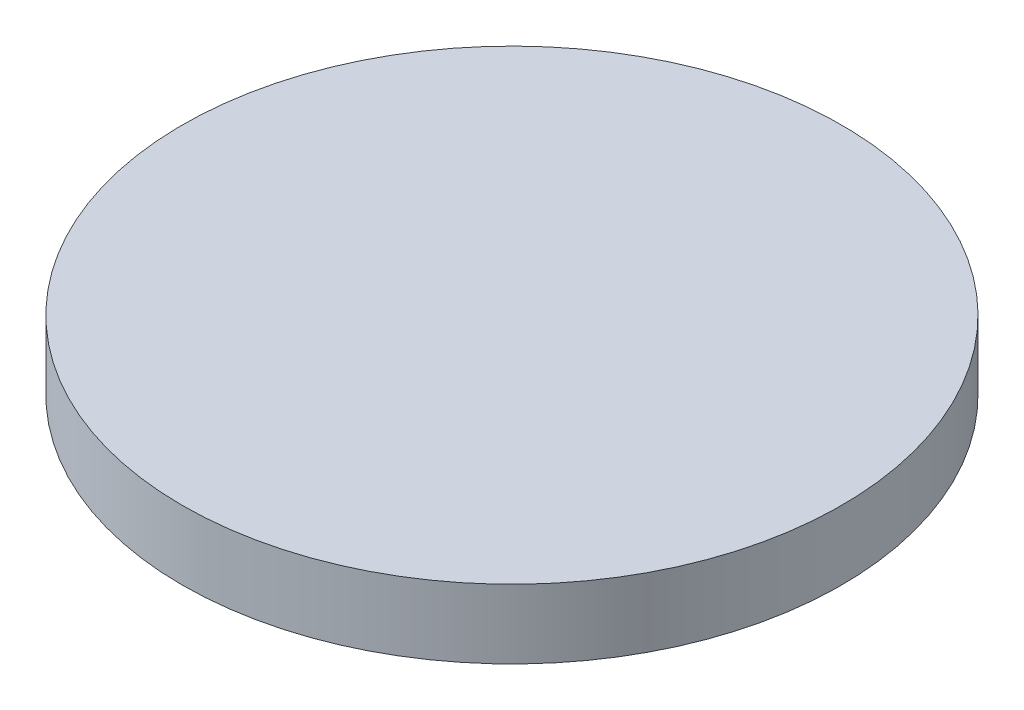
ISO-10303-21;
HEADER;
FILE_DESCRIPTION(('STEP AP214'),'2;1');
FILE_NAME('part.step','',(''),(''),'','','');
FILE_SCHEMA(('AUTOMOTIVE_DESIGN { 1 0 10303 214 1 1 1 1 }'));
ENDSEC;
DATA;
#1=APPLICATION_CONTEXT('core data for automotive mechanical design processes');
#2=APPLICATION_PROTOCOL_DEFINITION('international standard','automotive_design',2000,#1);
#3=PRODUCT_CONTEXT('',#1,'mechanical');
#4=PRODUCT('Part','Part','',(#3));
#5=PRODUCT_RELATED_PRODUCT_CATEGORY('part','',(#4));
#6=PRODUCT_DEFINITION_FORMATION('','',#4);
#7=PRODUCT_DEFINITION_CONTEXT('part definition',#1,'design');
#8=PRODUCT_DEFINITION('design','',#6,#7);
#9=PRODUCT_DEFINITION_SHAPE('','',#8);
#10=(LENGTH_UNIT() NAMED_UNIT(*) SI_UNIT(.MILLI.,.METRE.));
#11=(NAMED_UNIT(*) PLANE_ANGLE_UNIT() SI_UNIT($,.RADIAN.));
#12=(NAMED_UNIT(*) SI_UNIT($,.STERADIAN.) SOLID_ANGLE_UNIT());
#13=UNCERTAINTY_MEASURE_WITH_UNIT(LENGTH_MEASURE(1.E-05),#10,'distance_accuracy_value','');
#14=(GEOMETRIC_REPRESENTATION_CONTEXT(3) GLOBAL_UNCERTAINTY_ASSIGNED_CONTEXT((#13)) GLOBAL_UNIT_ASSIGNED_CONTEXT((#10,
#11,#12)) REPRESENTATION_CONTEXT('',''));
#15=CARTESIAN_POINT('',(0.,0.,0.));
#16=DIRECTION('',(0.,0.,1.));
#17=DIRECTION('',(1.,0.,0.));
#18=AXIS2_PLACEMENT_3D('',#15,#16,#17);
#19=CARTESIAN_POINT('',(0.,2.10000088,0.));
#20=DIRECTION('',(0.,-1.,0.));
#21=DIRECTION('',(0.,0.,-1.));
#22=AXIS2_PLACEMENT_3D('',#19,#20,#21);
#23=CYLINDRICAL_SURFACE('',#22,10.025000016);
#24=CARTESIAN_POINT('',(0.,2.10000088,0.));
#25=DIRECTION('',(0.,1.,0.));
#26=DIRECTION('',(0.,0.,1.));
#27=AXIS2_PLACEMENT_3D('',#24,#25,#26);
#28=CIRCLE('',#27,10.025000016);
#29=CARTESIAN_POINT('',(0.,2.10000088,10.025000016));
#30=VERTEX_POINT('',#29);
#31=EDGE_CURVE('E45',#30,#30,#28,.T.);
#32=ORIENTED_EDGE('',*,*,#31,.F.);
#33=EDGE_LOOP('',(#32));
#34=FACE_BOUND('',#33,.T.);
#35=CARTESIAN_POINT('',(0.,0.,0.));
#36=DIRECTION('',(0.,1.,0.));
#37=DIRECTION('',(0.,0.,1.));
#38=AXIS2_PLACEMENT_3D('',#35,#36,#37);
#39=CIRCLE('',#38,10.025000016);
#40=CARTESIAN_POINT('',(0.,0.,10.025000016));
#41=VERTEX_POINT('',#40);
#42=EDGE_CURVE('E40',#41,#41,#39,.T.);
#43=ORIENTED_EDGE('',*,*,#42,.T.);
#44=EDGE_LOOP('',(#43));
#45=FACE_BOUND('',#44,.T.);
#46=ADVANCED_FACE('F37',(#34,#45),#23,.T.);
#47=CARTESIAN_POINT('',(0.,2.10000088,0.));
#48=DIRECTION('',(0.,1.,0.));
#49=DIRECTION('',(0.,0.,1.));
#50=AXIS2_PLACEMENT_3D('',#47,#48,#49);
#51=PLANE('',#50);
#52=ORIENTED_EDGE('',*,*,#31,.T.);
#53=EDGE_LOOP('',(#52));
#54=FACE_BOUND('',#53,.T.);
#55=ADVANCED_FACE('F65',(#54),#51,.T.);
#56=CARTESIAN_POINT('',(0.,0.,0.));
#57=DIRECTION('',(0.,1.,0.));
#58=DIRECTION('',(0.,0.,1.));
#59=AXIS2_PLACEMENT_3D('',#56,#57,#58);
#60=PLANE('',#59);
#61=CARTESIAN_POINT('',(0.,0.,0.));
#62=DIRECTION('',(0.,-1.,0.));
#63=DIRECTION('',(0.,0.,-1.));
#64=AXIS2_PLACEMENT_3D('',#61,#62,#63);
#65=CIRCLE('',#64,4.3000041);
#66=CARTESIAN_POINT('',(0.,0.,-4.3000041));
#67=VERTEX_POINT('',#66);
#68=EDGE_CURVE('E10',#67,#67,#65,.T.);
#69=ORIENTED_EDGE('',*,*,#68,.F.);
#70=EDGE_LOOP('',(#69));
#71=FACE_BOUND('',#70,.T.);
#72=ORIENTED_EDGE('',*,*,#42,.F.);
#73=EDGE_LOOP('',(#72));
#74=FACE_BOUND('',#73,.T.);
#75=ADVANCED_FACE('F62',(#71,#74),#60,.F.);
#76=CARTESIAN_POINT('',(0.,-2.10000088,0.));
#77=DIRECTION('',(0.,1.,0.));
#78=DIRECTION('',(0.,0.,1.));
#79=AXIS2_PLACEMENT_3D('',#76,#77,#78);
#80=CYLINDRICAL_SURFACE('',#79,4.3000041);
#81=CARTESIAN_POINT('',(0.,-2.10000088,0.));
#82=DIRECTION('',(0.,-1.,0.));
#83=DIRECTION('',(0.,0.,-1.));
#84=AXIS2_PLACEMENT_3D('',#81,#82,#83);
#85=CIRCLE('',#84,4.3000041);
#86=CARTESIAN_POINT('',(0.,-2.10000088,-4.3000041));
#87=VERTEX_POINT('',#86);
#88=EDGE_CURVE('E52',#87,#87,#85,.T.);
#89=ORIENTED_EDGE('',*,*,#88,.F.);
#90=EDGE_LOOP('',(#89));
#91=FACE_BOUND('',#90,.T.);
#92=ORIENTED_EDGE('',*,*,#68,.T.);
#93=EDGE_LOOP('',(#92));
#94=FACE_BOUND('',#93,.T.);
#95=ADVANCED_FACE('F64',(#91,#94),#80,.T.);
#96=CARTESIAN_POINT('',(0.,-2.10000088,0.));
#97=DIRECTION('',(0.,-1.,0.));
#98=DIRECTION('',(0.,0.,-1.));
#99=AXIS2_PLACEMENT_3D('',#96,#97,#98);
#100=PLANE('',#99);
#101=ORIENTED_EDGE('',*,*,#88,.T.);
#102=EDGE_LOOP('',(#101));
#103=FACE_BOUND('',#102,.T.);
#104=ADVANCED_FACE('F71',(#103),#100,.T.);
#105=CLOSED_SHELL('',(#46,#55,#75,#95,#104));
#106=MANIFOLD_SOLID_BREP('B2',#105);
#107=ADVANCED_BREP_SHAPE_REPRESENTATION('',(#18,#106),#14);
#108=SHAPE_DEFINITION_REPRESENTATION(#9,#107);
ENDSEC;
END-ISO-10303-21;
